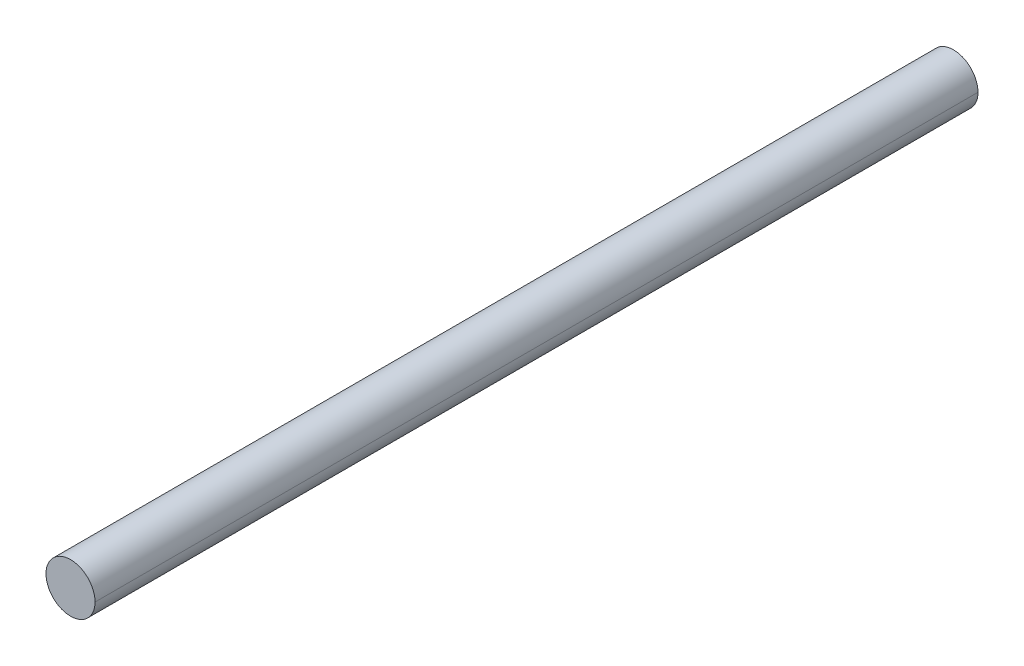
ISO-10303-21;
HEADER;
FILE_DESCRIPTION(('STEP AP214'),'2;1');
FILE_NAME('part.step','',(''),(''),'','','');
FILE_SCHEMA(('AUTOMOTIVE_DESIGN { 1 0 10303 214 1 1 1 1 }'));
ENDSEC;
DATA;
#1=APPLICATION_CONTEXT('core data for automotive mechanical design processes');
#2=APPLICATION_PROTOCOL_DEFINITION('international standard','automotive_design',2000,#1);
#3=PRODUCT_CONTEXT('',#1,'mechanical');
#4=PRODUCT('Part','Part','',(#3));
#5=PRODUCT_RELATED_PRODUCT_CATEGORY('part','',(#4));
#6=PRODUCT_DEFINITION_FORMATION('','',#4);
#7=PRODUCT_DEFINITION_CONTEXT('part definition',#1,'design');
#8=PRODUCT_DEFINITION('design','',#6,#7);
#9=PRODUCT_DEFINITION_SHAPE('','',#8);
#10=(LENGTH_UNIT() NAMED_UNIT(*) SI_UNIT(.MILLI.,.METRE.));
#11=(NAMED_UNIT(*) PLANE_ANGLE_UNIT() SI_UNIT($,.RADIAN.));
#12=(NAMED_UNIT(*) SI_UNIT($,.STERADIAN.) SOLID_ANGLE_UNIT());
#13=UNCERTAINTY_MEASURE_WITH_UNIT(LENGTH_MEASURE(1.E-05),#10,'distance_accuracy_value','');
#14=(GEOMETRIC_REPRESENTATION_CONTEXT(3) GLOBAL_UNCERTAINTY_ASSIGNED_CONTEXT((#13)) GLOBAL_UNIT_ASSIGNED_CONTEXT((#10,
#11,#12)) REPRESENTATION_CONTEXT('',''));
#15=CARTESIAN_POINT('',(0.,0.,0.));
#16=DIRECTION('',(0.,0.,1.));
#17=DIRECTION('',(1.,0.,0.));
#18=AXIS2_PLACEMENT_3D('',#15,#16,#17);
#19=CARTESIAN_POINT('',(0.,0.,450.));
#20=DIRECTION('',(0.,0.,-1.));
#21=DIRECTION('',(-1.,0.,0.));
#22=AXIS2_PLACEMENT_3D('',#19,#20,#21);
#23=CYLINDRICAL_SURFACE('',#22,12.5);
#24=CARTESIAN_POINT('',(0.,0.,450.));
#25=DIRECTION('',(0.,0.,1.));
#26=DIRECTION('',(1.,0.,0.));
#27=AXIS2_PLACEMENT_3D('',#24,#25,#26);
#28=CIRCLE('',#27,12.5);
#29=CARTESIAN_POINT('',(12.5,0.,450.));
#30=VERTEX_POINT('',#29);
#31=CARTESIAN_POINT('',(-12.5,0.,450.));
#32=VERTEX_POINT('',#31);
#33=EDGE_CURVE('E72',#30,#32,#28,.T.);
#34=ORIENTED_EDGE('',*,*,#33,.F.);
#35=DIRECTION('',(0.,0.,-1.));
#36=VECTOR('',#35,1.);
#37=CARTESIAN_POINT('',(12.5,0.,450.));
#38=LINE('',#37,#36);
#39=CARTESIAN_POINT('',(12.5,0.,0.));
#40=VERTEX_POINT('',#39);
#41=EDGE_CURVE('E20',#30,#40,#38,.T.);
#42=ORIENTED_EDGE('',*,*,#41,.T.);
#43=CARTESIAN_POINT('',(0.,0.,0.));
#44=DIRECTION('',(0.,0.,1.));
#45=DIRECTION('',(1.,0.,0.));
#46=AXIS2_PLACEMENT_3D('',#43,#44,#45);
#47=CIRCLE('',#46,12.5);
#48=CARTESIAN_POINT('',(-12.5,0.,0.));
#49=VERTEX_POINT('',#48);
#50=EDGE_CURVE('E61',#40,#49,#47,.T.);
#51=ORIENTED_EDGE('',*,*,#50,.T.);
#52=DIRECTION('',(0.,0.,-1.));
#53=VECTOR('',#52,1.);
#54=CARTESIAN_POINT('',(-12.5,0.,450.));
#55=LINE('',#54,#53);
#56=EDGE_CURVE('E10',#32,#49,#55,.T.);
#57=ORIENTED_EDGE('',*,*,#56,.F.);
#58=EDGE_LOOP('',(#34,#42,#51,#57));
#59=FACE_BOUND('',#58,.T.);
#60=ADVANCED_FACE('F16',(#59),#23,.T.);
#61=CARTESIAN_POINT('',(0.,0.,450.));
#62=DIRECTION('',(0.,0.,-1.));
#63=DIRECTION('',(-1.,0.,0.));
#64=AXIS2_PLACEMENT_3D('',#61,#62,#63);
#65=CYLINDRICAL_SURFACE('',#64,12.5);
#66=ORIENTED_EDGE('',*,*,#41,.F.);
#67=CARTESIAN_POINT('',(0.,0.,450.));
#68=DIRECTION('',(0.,0.,1.));
#69=DIRECTION('',(1.,0.,0.));
#70=AXIS2_PLACEMENT_3D('',#67,#68,#69);
#71=CIRCLE('',#70,12.5);
#72=EDGE_CURVE('E59',#32,#30,#71,.T.);
#73=ORIENTED_EDGE('',*,*,#72,.F.);
#74=ORIENTED_EDGE('',*,*,#56,.T.);
#75=CARTESIAN_POINT('',(0.,0.,0.));
#76=DIRECTION('',(0.,0.,1.));
#77=DIRECTION('',(1.,0.,0.));
#78=AXIS2_PLACEMENT_3D('',#75,#76,#77);
#79=CIRCLE('',#78,12.5);
#80=EDGE_CURVE('E57',#49,#40,#79,.T.);
#81=ORIENTED_EDGE('',*,*,#80,.T.);
#82=EDGE_LOOP('',(#66,#73,#74,#81));
#83=FACE_BOUND('',#82,.T.);
#84=ADVANCED_FACE('F55',(#83),#65,.T.);
#85=CARTESIAN_POINT('',(0.,0.,450.));
#86=DIRECTION('',(0.,0.,1.));
#87=DIRECTION('',(1.,0.,0.));
#88=AXIS2_PLACEMENT_3D('',#85,#86,#87);
#89=PLANE('',#88);
#90=ORIENTED_EDGE('',*,*,#72,.T.);
#91=ORIENTED_EDGE('',*,*,#33,.T.);
#92=EDGE_LOOP('',(#90,#91));
#93=FACE_BOUND('',#92,.T.);
#94=ADVANCED_FACE('F18',(#93),#89,.T.);
#95=CARTESIAN_POINT('',(0.,0.,0.));
#96=DIRECTION('',(0.,0.,1.));
#97=DIRECTION('',(1.,0.,0.));
#98=AXIS2_PLACEMENT_3D('',#95,#96,#97);
#99=PLANE('',#98);
#100=ORIENTED_EDGE('',*,*,#80,.F.);
#101=ORIENTED_EDGE('',*,*,#50,.F.);
#102=EDGE_LOOP('',(#100,#101));
#103=FACE_BOUND('',#102,.T.);
#104=ADVANCED_FACE('F65',(#103),#99,.F.);
#105=CLOSED_SHELL('',(#60,#84,#94,#104));
#106=MANIFOLD_SOLID_BREP('B1',#105);
#107=ADVANCED_BREP_SHAPE_REPRESENTATION('',(#18,#106),#14);
#108=SHAPE_DEFINITION_REPRESENTATION(#9,#107);
ENDSEC;
END-ISO-10303-21;
